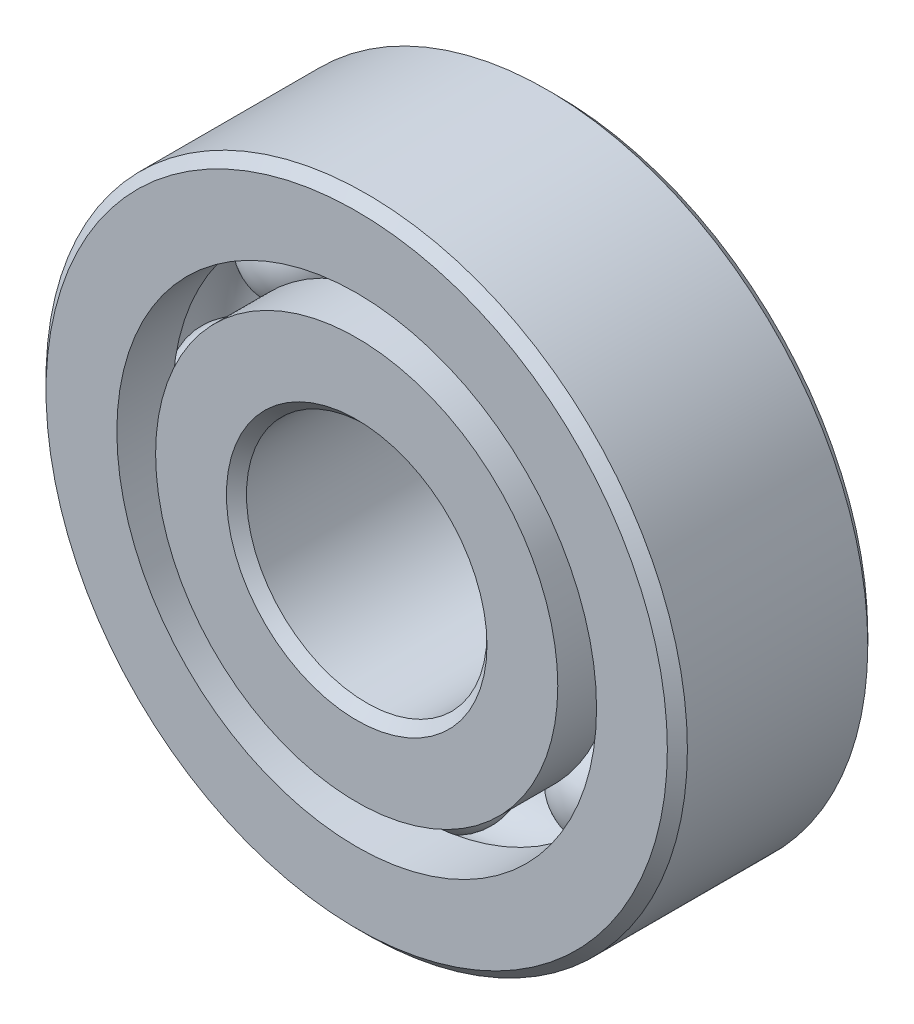
ISO-10303-21;
HEADER;
FILE_DESCRIPTION(('STEP AP214'),'2;1');
FILE_NAME('part.step','',(''),(''),'','','');
FILE_SCHEMA(('AUTOMOTIVE_DESIGN { 1 0 10303 214 1 1 1 1 }'));
ENDSEC;
DATA;
#1=APPLICATION_CONTEXT('core data for automotive mechanical design processes');
#2=APPLICATION_PROTOCOL_DEFINITION('international standard','automotive_design',2000,#1);
#3=PRODUCT_CONTEXT('',#1,'mechanical');
#4=PRODUCT('Part','Part','',(#3));
#5=PRODUCT_RELATED_PRODUCT_CATEGORY('part','',(#4));
#6=PRODUCT_DEFINITION_FORMATION('','',#4);
#7=PRODUCT_DEFINITION_CONTEXT('part definition',#1,'design');
#8=PRODUCT_DEFINITION('design','',#6,#7);
#9=PRODUCT_DEFINITION_SHAPE('','',#8);
#10=(LENGTH_UNIT() NAMED_UNIT(*) SI_UNIT(.MILLI.,.METRE.));
#11=(NAMED_UNIT(*) PLANE_ANGLE_UNIT() SI_UNIT($,.RADIAN.));
#12=(NAMED_UNIT(*) SI_UNIT($,.STERADIAN.) SOLID_ANGLE_UNIT());
#13=UNCERTAINTY_MEASURE_WITH_UNIT(LENGTH_MEASURE(1.E-05),#10,'distance_accuracy_value','');
#14=(GEOMETRIC_REPRESENTATION_CONTEXT(3) GLOBAL_UNCERTAINTY_ASSIGNED_CONTEXT((#13)) GLOBAL_UNIT_ASSIGNED_CONTEXT((#10,
#11,#12)) REPRESENTATION_CONTEXT('',''));
#15=CARTESIAN_POINT('',(0.,0.,0.));
#16=DIRECTION('',(0.,0.,1.));
#17=DIRECTION('',(1.,0.,0.));
#18=AXIS2_PLACEMENT_3D('',#15,#16,#17);
#19=CARTESIAN_POINT('',(-3.08696304161748,3.08696304161756,0.));
#20=DIRECTION('',(0.,0.,1.));
#21=DIRECTION('',(-0.707106781186539,0.707106781186556,0.));
#22=AXIS2_PLACEMENT_3D('',#19,#20,#21);
#23=SPHERICAL_SURFACE('',#22,0.961832467237323);
#24=CARTESIAN_POINT('',(-3.08696304161748,3.08696304161756,0.961832467237323));
#25=VERTEX_POINT('',#24);
#26=VERTEX_LOOP('',#25);
#27=FACE_BOUND('',#26,.T.);
#28=ADVANCED_FACE('F44',(#27),#23,.T.);
#29=CLOSED_SHELL('',(#28));
#30=MANIFOLD_SOLID_BREP('B2',#29);
#31=CARTESIAN_POINT('',(-4.365625,0.,0.));
#32=DIRECTION('',(0.,0.,1.));
#33=DIRECTION('',(-1.,0.,0.));
#34=AXIS2_PLACEMENT_3D('',#31,#32,#33);
#35=SPHERICAL_SURFACE('',#34,0.961832467237323);
#36=CARTESIAN_POINT('',(-4.365625,0.,0.961832467237323));
#37=VERTEX_POINT('',#36);
#38=VERTEX_LOOP('',#37);
#39=FACE_BOUND('',#38,.T.);
#40=ADVANCED_FACE('F68',(#39),#35,.T.);
#41=CLOSED_SHELL('',(#40));
#42=MANIFOLD_SOLID_BREP('B6',#41);
#43=CARTESIAN_POINT('',(-3.08696304161755,-3.08696304161749,0.));
#44=DIRECTION('',(0.,0.,1.));
#45=DIRECTION('',(-0.707106781186554,-0.707106781186541,0.));
#46=AXIS2_PLACEMENT_3D('',#43,#44,#45);
#47=SPHERICAL_SURFACE('',#46,0.961832467237323);
#48=CARTESIAN_POINT('',(-3.08696304161755,-3.08696304161749,0.961832467237323));
#49=VERTEX_POINT('',#48);
#50=VERTEX_LOOP('',#49);
#51=FACE_BOUND('',#50,.T.);
#52=ADVANCED_FACE('F92',(#51),#47,.T.);
#53=CLOSED_SHELL('',(#52));
#54=MANIFOLD_SOLID_BREP('B40',#53);
#55=CARTESIAN_POINT('',(0.,-4.365625,0.));
#56=DIRECTION('',(0.,0.,1.));
#57=DIRECTION('',(0.,-1.,0.));
#58=AXIS2_PLACEMENT_3D('',#55,#56,#57);
#59=SPHERICAL_SURFACE('',#58,0.961832467237323);
#60=CARTESIAN_POINT('',(0.,-4.365625,0.961832467237323));
#61=VERTEX_POINT('',#60);
#62=VERTEX_LOOP('',#61);
#63=FACE_BOUND('',#62,.T.);
#64=ADVANCED_FACE('F112',(#63),#59,.T.);
#65=CLOSED_SHELL('',(#64));
#66=MANIFOLD_SOLID_BREP('B64',#65);
#67=CARTESIAN_POINT('',(3.0869630416175,-3.08696304161754,0.));
#68=DIRECTION('',(0.,0.,1.));
#69=DIRECTION('',(0.707106781186544,-0.707106781186551,0.));
#70=AXIS2_PLACEMENT_3D('',#67,#68,#69);
#71=SPHERICAL_SURFACE('',#70,0.961832467237323);
#72=CARTESIAN_POINT('',(3.0869630416175,-3.08696304161754,0.961832467237323));
#73=VERTEX_POINT('',#72);
#74=VERTEX_LOOP('',#73);
#75=FACE_BOUND('',#74,.T.);
#76=ADVANCED_FACE('F133',(#75),#71,.T.);
#77=CLOSED_SHELL('',(#76));
#78=MANIFOLD_SOLID_BREP('B88',#77);
#79=CARTESIAN_POINT('',(4.365625,0.,0.));
#80=DIRECTION('',(0.,0.,1.));
#81=DIRECTION('',(1.,0.,0.));
#82=AXIS2_PLACEMENT_3D('',#79,#80,#81);
#83=SPHERICAL_SURFACE('',#82,0.961832467237323);
#84=CARTESIAN_POINT('',(4.365625,0.,0.961832467237323));
#85=VERTEX_POINT('',#84);
#86=VERTEX_LOOP('',#85);
#87=FACE_BOUND('',#86,.T.);
#88=ADVANCED_FACE('F157',(#87),#83,.T.);
#89=CLOSED_SHELL('',(#88));
#90=MANIFOLD_SOLID_BREP('B108',#89);
#91=CARTESIAN_POINT('',(3.08696304161753,3.08696304161752,0.));
#92=DIRECTION('',(0.,0.,1.));
#93=DIRECTION('',(0.707106781186549,0.707106781186546,0.));
#94=AXIS2_PLACEMENT_3D('',#91,#92,#93);
#95=SPHERICAL_SURFACE('',#94,0.961832467237323);
#96=CARTESIAN_POINT('',(3.08696304161753,3.08696304161752,0.961832467237323));
#97=VERTEX_POINT('',#96);
#98=VERTEX_LOOP('',#97);
#99=FACE_BOUND('',#98,.T.);
#100=ADVANCED_FACE('F177',(#99),#95,.T.);
#101=CLOSED_SHELL('',(#100));
#102=MANIFOLD_SOLID_BREP('B129',#101);
#103=CARTESIAN_POINT('',(0.,4.365625,0.));
#104=DIRECTION('',(0.,0.,1.));
#105=DIRECTION('',(0.,1.,0.));
#106=AXIS2_PLACEMENT_3D('',#103,#104,#105);
#107=SPHERICAL_SURFACE('',#106,0.961832467237323);
#108=CARTESIAN_POINT('',(0.,4.365625,0.961832467237323));
#109=VERTEX_POINT('',#108);
#110=VERTEX_LOOP('',#109);
#111=FACE_BOUND('',#110,.T.);
#112=ADVANCED_FACE('F201',(#111),#107,.T.);
#113=CLOSED_SHELL('',(#112));
#114=MANIFOLD_SOLID_BREP('B153',#113);
#115=CARTESIAN_POINT('',(0.,3.98183379120879,1.984375));
#116=DIRECTION('',(0.,0.,-1.));
#117=DIRECTION('',(-1.,0.,0.));
#118=AXIS2_PLACEMENT_3D('',#115,#116,#117);
#119=PLANE('',#118);
#120=CARTESIAN_POINT('',(0.,0.,1.984375));
#121=DIRECTION('',(0.,0.,1.));
#122=DIRECTION('',(1.,0.,0.));
#123=AXIS2_PLACEMENT_3D('',#120,#121,#122);
#124=CIRCLE('',#123,2.5796875);
#125=CARTESIAN_POINT('',(2.5796875,0.,1.984375));
#126=VERTEX_POINT('',#125);
#127=EDGE_CURVE('E256',#126,#126,#124,.T.);
#128=ORIENTED_EDGE('',*,*,#127,.F.);
#129=EDGE_LOOP('',(#128));
#130=FACE_BOUND('',#129,.T.);
#131=CARTESIAN_POINT('',(0.,0.,1.984375));
#132=DIRECTION('',(0.,0.,1.));
#133=DIRECTION('',(1.,0.,0.));
#134=AXIS2_PLACEMENT_3D('',#131,#132,#133);
#135=CIRCLE('',#134,3.98183379120879);
#136=CARTESIAN_POINT('',(3.98183379120879,0.,1.984375));
#137=VERTEX_POINT('',#136);
#138=EDGE_CURVE('E200',#137,#137,#135,.T.);
#139=ORIENTED_EDGE('',*,*,#138,.T.);
#140=EDGE_LOOP('',(#139));
#141=FACE_BOUND('',#140,.T.);
#142=ADVANCED_FACE('F228',(#130,#141),#119,.F.);
#143=CARTESIAN_POINT('',(0.,0.,1.984375));
#144=DIRECTION('',(0.,0.,1.));
#145=DIRECTION('',(1.,0.,0.));
#146=AXIS2_PLACEMENT_3D('',#143,#144,#145);
#147=CYLINDRICAL_SURFACE('',#146,3.98183379120879);
#148=ORIENTED_EDGE('',*,*,#138,.F.);
#149=EDGE_LOOP('',(#148));
#150=FACE_BOUND('',#149,.T.);
#151=CARTESIAN_POINT('',(0.,0.,0.881944444444444));
#152=DIRECTION('',(0.,0.,1.));
#153=DIRECTION('',(1.,0.,0.));
#154=AXIS2_PLACEMENT_3D('',#151,#152,#153);
#155=CIRCLE('',#154,3.98183379120879);
#156=CARTESIAN_POINT('',(3.98183379120879,0.,0.881944444444444));
#157=VERTEX_POINT('',#156);
#158=EDGE_CURVE('E234',#157,#157,#155,.T.);
#159=ORIENTED_EDGE('',*,*,#158,.T.);
#160=EDGE_LOOP('',(#159));
#161=FACE_BOUND('',#160,.T.);
#162=ADVANCED_FACE('F263',(#150,#161),#147,.T.);
#163=CARTESIAN_POINT('',(0.,0.,0.));
#164=DIRECTION('',(0.,0.,1.));
#165=DIRECTION('',(1.,0.,0.));
#166=AXIS2_PLACEMENT_3D('',#163,#164,#165);
#167=TOROIDAL_SURFACE('',#166,4.365625,0.961832467237322);
#168=ORIENTED_EDGE('',*,*,#158,.F.);
#169=EDGE_LOOP('',(#168));
#170=FACE_BOUND('',#169,.T.);
#171=CARTESIAN_POINT('',(0.,0.,-0.881944444444446));
#172=DIRECTION('',(0.,0.,1.));
#173=DIRECTION('',(1.,0.,0.));
#174=AXIS2_PLACEMENT_3D('',#171,#172,#173);
#175=CIRCLE('',#174,3.98183379120879);
#176=CARTESIAN_POINT('',(3.98183379120879,0.,-0.881944444444446));
#177=VERTEX_POINT('',#176);
#178=EDGE_CURVE('E238',#177,#177,#175,.T.);
#179=ORIENTED_EDGE('',*,*,#178,.T.);
#180=EDGE_LOOP('',(#179));
#181=FACE_BOUND('',#180,.T.);
#182=ADVANCED_FACE('F267',(#170,#181),#167,.F.);
#183=CARTESIAN_POINT('',(0.,0.,1.984375));
#184=DIRECTION('',(0.,0.,1.));
#185=DIRECTION('',(1.,0.,0.));
#186=AXIS2_PLACEMENT_3D('',#183,#184,#185);
#187=CYLINDRICAL_SURFACE('',#186,3.98183379120879);
#188=ORIENTED_EDGE('',*,*,#178,.F.);
#189=EDGE_LOOP('',(#188));
#190=FACE_BOUND('',#189,.T.);
#191=CARTESIAN_POINT('',(0.,0.,-1.984375));
#192=DIRECTION('',(0.,0.,1.));
#193=DIRECTION('',(1.,0.,0.));
#194=AXIS2_PLACEMENT_3D('',#191,#192,#193);
#195=CIRCLE('',#194,3.98183379120879);
#196=CARTESIAN_POINT('',(3.98183379120879,0.,-1.984375));
#197=VERTEX_POINT('',#196);
#198=EDGE_CURVE('E242',#197,#197,#195,.T.);
#199=ORIENTED_EDGE('',*,*,#198,.T.);
#200=EDGE_LOOP('',(#199));
#201=FACE_BOUND('',#200,.T.);
#202=ADVANCED_FACE('F272',(#190,#201),#187,.T.);
#203=CARTESIAN_POINT('',(0.,2.5796875,-1.984375));
#204=DIRECTION('',(0.,0.,1.));
#205=DIRECTION('',(1.,0.,0.));
#206=AXIS2_PLACEMENT_3D('',#203,#204,#205);
#207=PLANE('',#206);
#208=ORIENTED_EDGE('',*,*,#198,.F.);
#209=EDGE_LOOP('',(#208));
#210=FACE_BOUND('',#209,.T.);
#211=CARTESIAN_POINT('',(0.,0.,-1.984375));
#212=DIRECTION('',(0.,0.,1.));
#213=DIRECTION('',(1.,0.,0.));
#214=AXIS2_PLACEMENT_3D('',#211,#212,#213);
#215=CIRCLE('',#214,2.5796875);
#216=CARTESIAN_POINT('',(2.5796875,0.,-1.984375));
#217=VERTEX_POINT('',#216);
#218=EDGE_CURVE('E247',#217,#217,#215,.T.);
#219=ORIENTED_EDGE('',*,*,#218,.T.);
#220=EDGE_LOOP('',(#219));
#221=FACE_BOUND('',#220,.T.);
#222=ADVANCED_FACE('F278',(#210,#221),#207,.F.);
#223=CARTESIAN_POINT('',(0.,0.,-1.7859375));
#224=DIRECTION('',(0.,0.,-1.));
#225=DIRECTION('',(-1.,0.,0.));
#226=AXIS2_PLACEMENT_3D('',#223,#224,#225);
#227=CONICAL_SURFACE('',#226,2.38125,0.785398163397443);
#228=ORIENTED_EDGE('',*,*,#218,.F.);
#229=EDGE_LOOP('',(#228));
#230=FACE_BOUND('',#229,.T.);
#231=CARTESIAN_POINT('',(0.,0.,-1.7859375));
#232=DIRECTION('',(0.,0.,1.));
#233=DIRECTION('',(1.,0.,0.));
#234=AXIS2_PLACEMENT_3D('',#231,#232,#233);
#235=CIRCLE('',#234,2.38125);
#236=CARTESIAN_POINT('',(2.38125,0.,-1.7859375));
#237=VERTEX_POINT('',#236);
#238=EDGE_CURVE('E250',#237,#237,#235,.T.);
#239=ORIENTED_EDGE('',*,*,#238,.T.);
#240=EDGE_LOOP('',(#239));
#241=FACE_BOUND('',#240,.T.);
#242=ADVANCED_FACE('F282',(#230,#241),#227,.F.);
#243=CARTESIAN_POINT('',(0.,0.,1.984375));
#244=DIRECTION('',(0.,0.,1.));
#245=DIRECTION('',(1.,0.,0.));
#246=AXIS2_PLACEMENT_3D('',#243,#244,#245);
#247=CYLINDRICAL_SURFACE('',#246,2.38125);
#248=ORIENTED_EDGE('',*,*,#238,.F.);
#249=EDGE_LOOP('',(#248));
#250=FACE_BOUND('',#249,.T.);
#251=CARTESIAN_POINT('',(0.,0.,1.7859375));
#252=DIRECTION('',(0.,0.,1.));
#253=DIRECTION('',(1.,0.,0.));
#254=AXIS2_PLACEMENT_3D('',#251,#252,#253);
#255=CIRCLE('',#254,2.38125);
#256=CARTESIAN_POINT('',(2.38125,0.,1.7859375));
#257=VERTEX_POINT('',#256);
#258=EDGE_CURVE('E253',#257,#257,#255,.T.);
#259=ORIENTED_EDGE('',*,*,#258,.T.);
#260=EDGE_LOOP('',(#259));
#261=FACE_BOUND('',#260,.T.);
#262=ADVANCED_FACE('F286',(#250,#261),#247,.F.);
#263=CARTESIAN_POINT('',(0.,0.,1.984375));
#264=DIRECTION('',(0.,0.,1.));
#265=DIRECTION('',(1.,0.,0.));
#266=AXIS2_PLACEMENT_3D('',#263,#264,#265);
#267=CONICAL_SURFACE('',#266,2.5796875,0.785398163397454);
#268=ORIENTED_EDGE('',*,*,#258,.F.);
#269=EDGE_LOOP('',(#268));
#270=FACE_BOUND('',#269,.T.);
#271=ORIENTED_EDGE('',*,*,#127,.T.);
#272=EDGE_LOOP('',(#271));
#273=FACE_BOUND('',#272,.T.);
#274=ADVANCED_FACE('F260',(#270,#273),#267,.F.);
#275=CLOSED_SHELL('',(#142,#162,#182,#202,#222,#242,#262,#274));
#276=MANIFOLD_SOLID_BREP('B173',#275);
#277=CARTESIAN_POINT('',(0.,0.,1.7859375));
#278=DIRECTION('',(0.,0.,-1.));
#279=DIRECTION('',(-1.,0.,0.));
#280=AXIS2_PLACEMENT_3D('',#277,#278,#279);
#281=CONICAL_SURFACE('',#280,6.35,0.785398163397446);
#282=CARTESIAN_POINT('',(0.,0.,1.984375));
#283=DIRECTION('',(0.,0.,1.));
#284=DIRECTION('',(1.,0.,0.));
#285=AXIS2_PLACEMENT_3D('',#282,#283,#284);
#286=CIRCLE('',#285,6.1515625);
#287=CARTESIAN_POINT('',(6.1515625,0.,1.984375));
#288=VERTEX_POINT('',#287);
#289=EDGE_CURVE('E383',#288,#288,#286,.T.);
#290=ORIENTED_EDGE('',*,*,#289,.F.);
#291=EDGE_LOOP('',(#290));
#292=FACE_BOUND('',#291,.T.);
#293=CARTESIAN_POINT('',(0.,0.,1.7859375));
#294=DIRECTION('',(0.,0.,1.));
#295=DIRECTION('',(1.,0.,0.));
#296=AXIS2_PLACEMENT_3D('',#293,#294,#295);
#297=CIRCLE('',#296,6.35);
#298=CARTESIAN_POINT('',(6.35,0.,1.7859375));
#299=VERTEX_POINT('',#298);
#300=EDGE_CURVE('E227',#299,#299,#297,.T.);
#301=ORIENTED_EDGE('',*,*,#300,.T.);
#302=EDGE_LOOP('',(#301));
#303=FACE_BOUND('',#302,.T.);
#304=ADVANCED_FACE('F355',(#292,#303),#281,.T.);
#305=CARTESIAN_POINT('',(0.,0.,1.984375));
#306=DIRECTION('',(0.,0.,1.));
#307=DIRECTION('',(1.,0.,0.));
#308=AXIS2_PLACEMENT_3D('',#305,#306,#307);
#309=CYLINDRICAL_SURFACE('',#308,6.35);
#310=ORIENTED_EDGE('',*,*,#300,.F.);
#311=EDGE_LOOP('',(#310));
#312=FACE_BOUND('',#311,.T.);
#313=CARTESIAN_POINT('',(0.,0.,-1.7859375));
#314=DIRECTION('',(0.,0.,1.));
#315=DIRECTION('',(1.,0.,0.));
#316=AXIS2_PLACEMENT_3D('',#313,#314,#315);
#317=CIRCLE('',#316,6.35);
#318=CARTESIAN_POINT('',(6.35,0.,-1.7859375));
#319=VERTEX_POINT('',#318);
#320=EDGE_CURVE('E361',#319,#319,#317,.T.);
#321=ORIENTED_EDGE('',*,*,#320,.T.);
#322=EDGE_LOOP('',(#321));
#323=FACE_BOUND('',#322,.T.);
#324=ADVANCED_FACE('F390',(#312,#323),#309,.T.);
#325=CARTESIAN_POINT('',(0.,0.,-1.984375));
#326=DIRECTION('',(0.,0.,1.));
#327=DIRECTION('',(1.,0.,0.));
#328=AXIS2_PLACEMENT_3D('',#325,#326,#327);
#329=CONICAL_SURFACE('',#328,6.1515625,0.785398163397444);
#330=ORIENTED_EDGE('',*,*,#320,.F.);
#331=EDGE_LOOP('',(#330));
#332=FACE_BOUND('',#331,.T.);
#333=CARTESIAN_POINT('',(0.,0.,-1.984375));
#334=DIRECTION('',(0.,0.,1.));
#335=DIRECTION('',(1.,0.,0.));
#336=AXIS2_PLACEMENT_3D('',#333,#334,#335);
#337=CIRCLE('',#336,6.1515625);
#338=CARTESIAN_POINT('',(6.1515625,0.,-1.984375));
#339=VERTEX_POINT('',#338);
#340=EDGE_CURVE('E365',#339,#339,#337,.T.);
#341=ORIENTED_EDGE('',*,*,#340,.T.);
#342=EDGE_LOOP('',(#341));
#343=FACE_BOUND('',#342,.T.);
#344=ADVANCED_FACE('F394',(#332,#343),#329,.T.);
#345=CARTESIAN_POINT('',(0.,6.1515625,-1.984375));
#346=DIRECTION('',(0.,0.,1.));
#347=DIRECTION('',(1.,0.,0.));
#348=AXIS2_PLACEMENT_3D('',#345,#346,#347);
#349=PLANE('',#348);
#350=ORIENTED_EDGE('',*,*,#340,.F.);
#351=EDGE_LOOP('',(#350));
#352=FACE_BOUND('',#351,.T.);
#353=CARTESIAN_POINT('',(0.,0.,-1.984375));
#354=DIRECTION('',(0.,0.,1.));
#355=DIRECTION('',(1.,0.,0.));
#356=AXIS2_PLACEMENT_3D('',#353,#354,#355);
#357=CIRCLE('',#356,4.74941620879121);
#358=CARTESIAN_POINT('',(4.74941620879121,0.,-1.984375));
#359=VERTEX_POINT('',#358);
#360=EDGE_CURVE('E369',#359,#359,#357,.T.);
#361=ORIENTED_EDGE('',*,*,#360,.T.);
#362=EDGE_LOOP('',(#361));
#363=FACE_BOUND('',#362,.T.);
#364=ADVANCED_FACE('F399',(#352,#363),#349,.F.);
#365=CARTESIAN_POINT('',(0.,0.,1.984375));
#366=DIRECTION('',(0.,0.,1.));
#367=DIRECTION('',(1.,0.,0.));
#368=AXIS2_PLACEMENT_3D('',#365,#366,#367);
#369=CYLINDRICAL_SURFACE('',#368,4.74941620879121);
#370=ORIENTED_EDGE('',*,*,#360,.F.);
#371=EDGE_LOOP('',(#370));
#372=FACE_BOUND('',#371,.T.);
#373=CARTESIAN_POINT('',(0.,0.,-0.881944444444445));
#374=DIRECTION('',(0.,0.,1.));
#375=DIRECTION('',(1.,0.,0.));
#376=AXIS2_PLACEMENT_3D('',#373,#374,#375);
#377=CIRCLE('',#376,4.74941620879121);
#378=CARTESIAN_POINT('',(4.74941620879121,0.,-0.881944444444445));
#379=VERTEX_POINT('',#378);
#380=EDGE_CURVE('E374',#379,#379,#377,.T.);
#381=ORIENTED_EDGE('',*,*,#380,.T.);
#382=EDGE_LOOP('',(#381));
#383=FACE_BOUND('',#382,.T.);
#384=ADVANCED_FACE('F405',(#372,#383),#369,.F.);
#385=CARTESIAN_POINT('',(0.,0.,0.));
#386=DIRECTION('',(0.,0.,1.));
#387=DIRECTION('',(1.,0.,0.));
#388=AXIS2_PLACEMENT_3D('',#385,#386,#387);
#389=TOROIDAL_SURFACE('',#388,4.365625,0.961832467237323);
#390=ORIENTED_EDGE('',*,*,#380,.F.);
#391=EDGE_LOOP('',(#390));
#392=FACE_BOUND('',#391,.T.);
#393=CARTESIAN_POINT('',(0.,0.,0.881944444444444));
#394=DIRECTION('',(0.,0.,1.));
#395=DIRECTION('',(1.,0.,0.));
#396=AXIS2_PLACEMENT_3D('',#393,#394,#395);
#397=CIRCLE('',#396,4.74941620879121);
#398=CARTESIAN_POINT('',(4.74941620879121,0.,0.881944444444444));
#399=VERTEX_POINT('',#398);
#400=EDGE_CURVE('E377',#399,#399,#397,.T.);
#401=ORIENTED_EDGE('',*,*,#400,.T.);
#402=EDGE_LOOP('',(#401));
#403=FACE_BOUND('',#402,.T.);
#404=ADVANCED_FACE('F409',(#392,#403),#389,.F.);
#405=CARTESIAN_POINT('',(0.,0.,1.984375));
#406=DIRECTION('',(0.,0.,1.));
#407=DIRECTION('',(1.,0.,0.));
#408=AXIS2_PLACEMENT_3D('',#405,#406,#407);
#409=CYLINDRICAL_SURFACE('',#408,4.74941620879121);
#410=ORIENTED_EDGE('',*,*,#400,.F.);
#411=EDGE_LOOP('',(#410));
#412=FACE_BOUND('',#411,.T.);
#413=CARTESIAN_POINT('',(0.,0.,1.984375));
#414=DIRECTION('',(0.,0.,1.));
#415=DIRECTION('',(1.,0.,0.));
#416=AXIS2_PLACEMENT_3D('',#413,#414,#415);
#417=CIRCLE('',#416,4.74941620879121);
#418=CARTESIAN_POINT('',(4.74941620879121,0.,1.984375));
#419=VERTEX_POINT('',#418);
#420=EDGE_CURVE('E380',#419,#419,#417,.T.);
#421=ORIENTED_EDGE('',*,*,#420,.T.);
#422=EDGE_LOOP('',(#421));
#423=FACE_BOUND('',#422,.T.);
#424=ADVANCED_FACE('F413',(#412,#423),#409,.F.);
#425=CARTESIAN_POINT('',(0.,6.1515625,1.984375));
#426=DIRECTION('',(0.,0.,-1.));
#427=DIRECTION('',(-1.,0.,0.));
#428=AXIS2_PLACEMENT_3D('',#425,#426,#427);
#429=PLANE('',#428);
#430=ORIENTED_EDGE('',*,*,#420,.F.);
#431=EDGE_LOOP('',(#430));
#432=FACE_BOUND('',#431,.T.);
#433=ORIENTED_EDGE('',*,*,#289,.T.);
#434=EDGE_LOOP('',(#433));
#435=FACE_BOUND('',#434,.T.);
#436=ADVANCED_FACE('F387',(#432,#435),#429,.F.);
#437=CLOSED_SHELL('',(#304,#324,#344,#364,#384,#404,#424,#436));
#438=MANIFOLD_SOLID_BREP('B195',#437);
#439=ADVANCED_BREP_SHAPE_REPRESENTATION('',(#18,#30,#42,#54,#66,#78,#90,#102,#114,#276,#438),#14);
#440=SHAPE_DEFINITION_REPRESENTATION(#9,#439);
ENDSEC;
END-ISO-10303-21;
